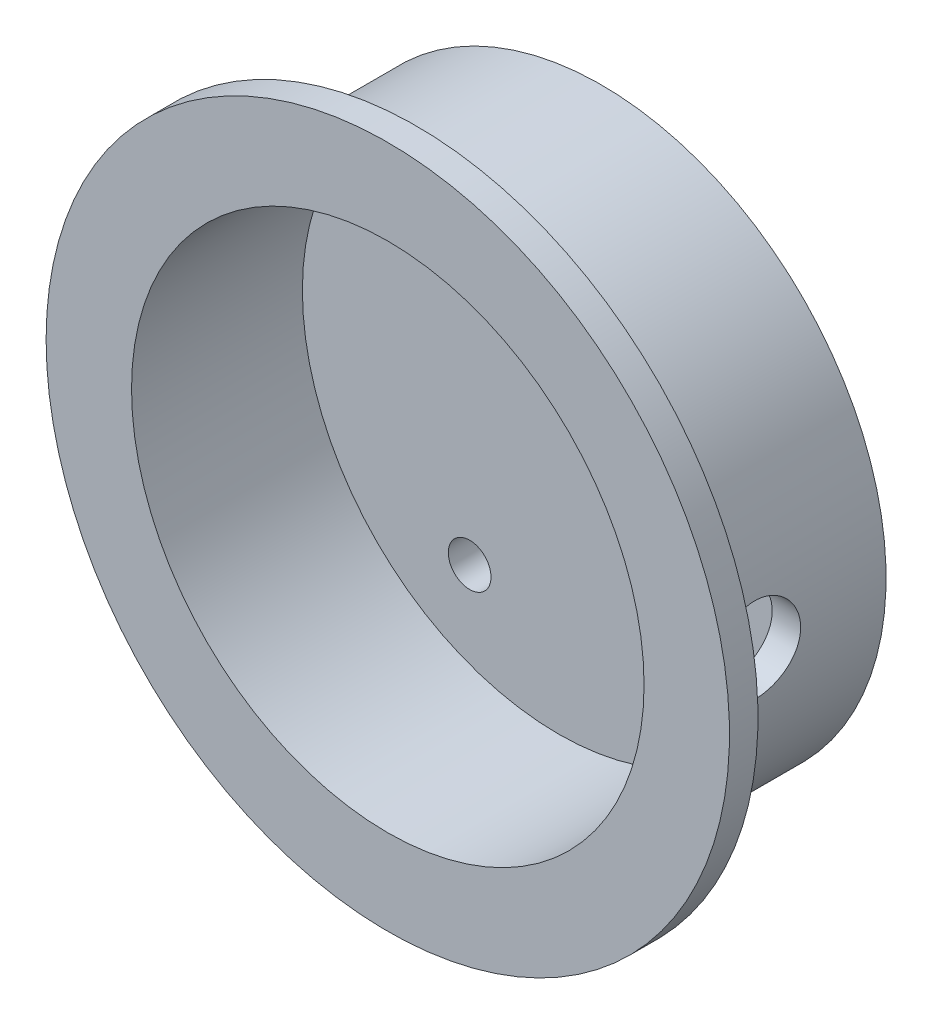
ISO-10303-21;
HEADER;
FILE_DESCRIPTION(('STEP AP214'),'2;1');
FILE_NAME('part.step','',(''),(''),'','','');
FILE_SCHEMA(('AUTOMOTIVE_DESIGN { 1 0 10303 214 1 1 1 1 }'));
ENDSEC;
DATA;
#1=APPLICATION_CONTEXT('core data for automotive mechanical design processes');
#2=APPLICATION_PROTOCOL_DEFINITION('international standard','automotive_design',2000,#1);
#3=PRODUCT_CONTEXT('',#1,'mechanical');
#4=PRODUCT('Part','Part','',(#3));
#5=PRODUCT_RELATED_PRODUCT_CATEGORY('part','',(#4));
#6=PRODUCT_DEFINITION_FORMATION('','',#4);
#7=PRODUCT_DEFINITION_CONTEXT('part definition',#1,'design');
#8=PRODUCT_DEFINITION('design','',#6,#7);
#9=PRODUCT_DEFINITION_SHAPE('','',#8);
#10=(LENGTH_UNIT() NAMED_UNIT(*) SI_UNIT(.MILLI.,.METRE.));
#11=(NAMED_UNIT(*) PLANE_ANGLE_UNIT() SI_UNIT($,.RADIAN.));
#12=(NAMED_UNIT(*) SI_UNIT($,.STERADIAN.) SOLID_ANGLE_UNIT());
#13=UNCERTAINTY_MEASURE_WITH_UNIT(LENGTH_MEASURE(1.E-05),#10,'distance_accuracy_value','');
#14=(GEOMETRIC_REPRESENTATION_CONTEXT(3) GLOBAL_UNCERTAINTY_ASSIGNED_CONTEXT((#13)) GLOBAL_UNIT_ASSIGNED_CONTEXT((#10,
#11,#12)) REPRESENTATION_CONTEXT('',''));
#15=CARTESIAN_POINT('',(0.,0.,0.));
#16=DIRECTION('',(0.,0.,1.));
#17=DIRECTION('',(1.,0.,0.));
#18=AXIS2_PLACEMENT_3D('',#15,#16,#17);
#19=CARTESIAN_POINT('',(0.,0.,0.));
#20=DIRECTION('',(0.,0.,1.));
#21=DIRECTION('',(1.,0.,0.));
#22=AXIS2_PLACEMENT_3D('',#19,#20,#21);
#23=PLANE('',#22);
#24=CARTESIAN_POINT('',(25.,0.,0.));
#25=DIRECTION('',(0.,0.,1.));
#26=DIRECTION('',(1.,0.,0.));
#27=AXIS2_PLACEMENT_3D('',#24,#25,#26);
#28=CIRCLE('',#27,3.);
#29=CARTESIAN_POINT('',(28.,0.,0.));
#30=VERTEX_POINT('',#29);
#31=EDGE_CURVE('E80',#30,#30,#28,.T.);
#32=ORIENTED_EDGE('',*,*,#31,.T.);
#33=EDGE_LOOP('',(#32));
#34=FACE_BOUND('',#33,.T.);
#35=CARTESIAN_POINT('',(-12.5,21.650635,0.));
#36=DIRECTION('',(0.,0.,1.));
#37=DIRECTION('',(1.,0.,0.));
#38=AXIS2_PLACEMENT_3D('',#35,#36,#37);
#39=CIRCLE('',#38,3.);
#40=CARTESIAN_POINT('',(-9.5,21.650635,0.));
#41=VERTEX_POINT('',#40);
#42=EDGE_CURVE('E148',#41,#41,#39,.T.);
#43=ORIENTED_EDGE('',*,*,#42,.T.);
#44=EDGE_LOOP('',(#43));
#45=FACE_BOUND('',#44,.T.);
#46=CARTESIAN_POINT('',(-12.5,-21.650635,0.));
#47=DIRECTION('',(0.,0.,1.));
#48=DIRECTION('',(1.,0.,0.));
#49=AXIS2_PLACEMENT_3D('',#46,#47,#48);
#50=CIRCLE('',#49,3.);
#51=CARTESIAN_POINT('',(-9.5,-21.650635,0.));
#52=VERTEX_POINT('',#51);
#53=EDGE_CURVE('E101',#52,#52,#50,.T.);
#54=ORIENTED_EDGE('',*,*,#53,.T.);
#55=EDGE_LOOP('',(#54));
#56=FACE_BOUND('',#55,.T.);
#57=CARTESIAN_POINT('',(0.,0.,0.));
#58=DIRECTION('',(0.,0.,-1.));
#59=DIRECTION('',(-1.,0.,0.));
#60=AXIS2_PLACEMENT_3D('',#57,#58,#59);
#61=CIRCLE('',#60,40.);
#62=CARTESIAN_POINT('',(-40.,0.,0.));
#63=VERTEX_POINT('',#62);
#64=EDGE_CURVE('E10',#63,#63,#61,.T.);
#65=ORIENTED_EDGE('',*,*,#64,.T.);
#66=EDGE_LOOP('',(#65));
#67=FACE_BOUND('',#66,.T.);
#68=ADVANCED_FACE('F49',(#34,#45,#56,#67),#23,.F.);
#69=CARTESIAN_POINT('',(0.,0.,0.));
#70=DIRECTION('',(0.,0.,-1.));
#71=DIRECTION('',(-1.,0.,0.));
#72=AXIS2_PLACEMENT_3D('',#69,#70,#71);
#73=CYLINDRICAL_SURFACE('',#72,40.);
#74=CARTESIAN_POINT('',(40.,0.,12.));
#75=CARTESIAN_POINT('',(40.000000904638,-0.167561105518913,11.9999977152975));
#76=CARTESIAN_POINT('',(39.9989451176864,-0.335090191065302,12.0070215038962));
#77=CARTESIAN_POINT('',(39.9947534088658,-0.668999463498546,12.0350604514898));
#78=CARTESIAN_POINT('',(39.9916170491914,-0.835379401128417,12.0560785552486));
#79=CARTESIAN_POINT('',(39.9833481266628,-1.16585651084397,12.1119708513691));
#80=CARTESIAN_POINT('',(39.9782142059875,-1.32995205138041,12.1468544690176));
#81=CARTESIAN_POINT('',(39.9660925834295,-1.65464372746493,12.2302290278119));
#82=CARTESIAN_POINT('',(39.9591042019049,-1.81523855663821,12.2787249581143));
#83=CARTESIAN_POINT('',(39.9434791838253,-2.13155359781161,12.3888952510529));
#84=CARTESIAN_POINT('',(39.9348444241858,-2.28727912787763,12.4505546165052));
#85=CARTESIAN_POINT('',(39.916158647382,-2.59301886203376,12.586658715246));
#86=CARTESIAN_POINT('',(39.9061071086739,-2.7430309369425,12.6611081590292));
#87=CARTESIAN_POINT('',(39.8848748981357,-3.03617232953861,12.8221998890339));
#88=CARTESIAN_POINT('',(39.8736948141771,-3.17930517391521,12.9088358363352));
#89=CARTESIAN_POINT('',(39.8505062684972,-3.45784494761421,13.0937525852414));
#90=CARTESIAN_POINT('',(39.8384975000402,-3.59324898188084,13.1920377085293));
#91=CARTESIAN_POINT('',(39.8139061121188,-3.85622077185467,13.4002313424211));
#92=CARTESIAN_POINT('',(39.8013202201906,-3.98373072094197,13.5102124887627));
#93=CARTESIAN_POINT('',(39.7759972467748,-4.22909734059826,13.7405329580976));
#94=CARTESIAN_POINT('',(39.7632601110613,-4.3469504213998,13.8608760991906));
#95=CARTESIAN_POINT('',(39.7380010552656,-4.57210070831189,14.1110153472033));
#96=CARTESIAN_POINT('',(39.7254790697345,-4.67940117319674,14.2408085141573));
#97=CARTESIAN_POINT('',(39.7009948267804,-4.88277663169576,14.5090359266964));
#98=CARTESIAN_POINT('',(39.6890327775157,-4.97884747021878,14.6474733418682));
#99=CARTESIAN_POINT('',(39.6659601731825,-5.15945090824631,14.932642970488));
#100=CARTESIAN_POINT('',(39.6548537615265,-5.24392874239037,15.0794102164307));
#101=CARTESIAN_POINT('',(39.6338696788524,-5.40024032800484,15.3796814818054));
#102=CARTESIAN_POINT('',(39.623992466415,-5.47206936467646,15.5331879867512));
#103=CARTESIAN_POINT('',(39.6057632358151,-5.6024875795219,15.8457527723132));
#104=CARTESIAN_POINT('',(39.5974105895113,-5.66108221281806,16.0048087341588));
#105=CARTESIAN_POINT('',(39.5824652471853,-5.76464588036792,16.3273938916457));
#106=CARTESIAN_POINT('',(39.5758731955011,-5.80960992694476,16.4909247009076));
#107=CARTESIAN_POINT('',(39.5591431868777,-5.92286347468619,16.9838814910322));
#108=CARTESIAN_POINT('',(39.5518880953599,-5.97064287422985,17.318386497531));
#109=CARTESIAN_POINT('',(39.5460104933124,-6.00944223175643,17.9905557371175));
#110=CARTESIAN_POINT('',(39.5473874871253,-6.00046544869915,18.3282197877));
#111=CARTESIAN_POINT('',(39.5585496514257,-5.92642475851388,18.9943908015818));
#112=CARTESIAN_POINT('',(39.5682649962954,-5.86182661199707,19.3229504829541));
#113=CARTESIAN_POINT('',(39.5949040792143,-5.67908592129697,19.9645010985737));
#114=CARTESIAN_POINT('',(39.6118280211808,-5.56094186239592,20.2774915921187));
#115=CARTESIAN_POINT('',(39.651053488073,-5.27398381101333,20.8804525087129));
#116=CARTESIAN_POINT('',(39.6733758884201,-5.10497248282539,21.1703276146447));
#117=CARTESIAN_POINT('',(39.7208682852217,-4.72121661366651,21.7177786448698));
#118=CARTESIAN_POINT('',(39.7460384685193,-4.50646907112456,21.9753524475332));
#119=CARTESIAN_POINT('',(39.7966989270769,-4.03477969906616,22.4535905717985));
#120=CARTESIAN_POINT('',(39.8221898858062,-3.77743731211938,22.6738599420845));
#121=CARTESIAN_POINT('',(39.8703859046449,-3.2292283660254,23.06814375709));
#122=CARTESIAN_POINT('',(39.8930909525546,-2.93836166008339,23.2421579992585));
#123=CARTESIAN_POINT('',(39.9331806237617,-2.331018391123,23.5390123409123));
#124=CARTESIAN_POINT('',(39.9505620771063,-2.01452671087442,23.6618219660951));
#125=CARTESIAN_POINT('',(39.9780196221935,-1.36509273042091,23.8524375600075));
#126=CARTESIAN_POINT('',(39.9880962078078,-1.0321515439695,23.9202472472411));
#127=CARTESIAN_POINT('',(39.9997432453657,-0.362678270417002,23.9984129192878));
#128=CARTESIAN_POINT('',(40.0013940835711,-0.0262109273182469,24.009311886843));
#129=CARTESIAN_POINT('',(39.9962224406535,0.64374671048551,23.9747879774302));
#130=CARTESIAN_POINT('',(39.9894002218434,0.977237097030591,23.929366844046));
#131=CARTESIAN_POINT('',(39.9680987444256,1.63012955022016,23.7839436045459));
#132=CARTESIAN_POINT('',(39.9536566076142,1.94959185413062,23.6842060355374));
#133=CARTESIAN_POINT('',(39.91872942704,2.56725983276065,23.4332599904913));
#134=CARTESIAN_POINT('',(39.8982440994957,2.8654645084294,23.2820490972735));
#135=CARTESIAN_POINT('',(39.8533072960952,3.43453992396779,22.9311751756704));
#136=CARTESIAN_POINT('',(39.8288280551376,3.70519606502782,22.7311677167789));
#137=CARTESIAN_POINT('',(39.7787145304194,4.20929466724779,22.288856476639));
#138=CARTESIAN_POINT('',(39.7530801795945,4.44273496411942,22.0465502372194));
#139=CARTESIAN_POINT('',(39.7032905347918,4.86775149413185,21.5241069093635));
#140=CARTESIAN_POINT('',(39.6791493006289,5.05896374897781,21.2436722033505));
#141=CARTESIAN_POINT('',(39.6353289042669,5.3915648117521,20.6543319339288));
#142=CARTESIAN_POINT('',(39.6156496215148,5.53295496583064,20.3454271400419));
#143=CARTESIAN_POINT('',(39.5830807993143,5.7613400286209,19.7090643875868));
#144=CARTESIAN_POINT('',(39.570167378912,5.84852646230101,19.3816762648898));
#145=CARTESIAN_POINT('',(39.5525372331235,5.96661700377158,18.7165098332219));
#146=CARTESIAN_POINT('',(39.5478199416889,5.9975249983212,18.3787322434175));
#147=CARTESIAN_POINT('',(39.5472834921233,6.00101575215408,17.8738165183001));
#148=CARTESIAN_POINT('',(39.5481759057259,5.99515666053904,17.706560625329));
#149=CARTESIAN_POINT('',(39.5520574049984,5.96950339135657,17.3731623070127));
#150=CARTESIAN_POINT('',(39.5550457059416,5.94971442929869,17.2070194884152));
#151=CARTESIAN_POINT('',(39.5630376239274,5.89633514048051,16.8769665226951));
#152=CARTESIAN_POINT('',(39.5680419665934,5.86273984439065,16.713057201447));
#153=CARTESIAN_POINT('',(39.579918267669,5.78201823632873,16.3887348610991));
#154=CARTESIAN_POINT('',(39.5867895508178,5.73489681632584,16.2283206004739));
#155=CARTESIAN_POINT('',(39.6022008561964,5.62748842275754,15.9121196212927));
#156=CARTESIAN_POINT('',(39.6107401970208,5.56720682397764,15.7563310429708));
#157=CARTESIAN_POINT('',(39.629243299894,5.43393018153574,15.4504461800627));
#158=CARTESIAN_POINT('',(39.6392065485716,5.36093971782559,15.3003478684972));
#159=CARTESIAN_POINT('',(39.6602830942565,5.20272169948106,15.0067567816112));
#160=CARTESIAN_POINT('',(39.6713968292032,5.11748948013186,14.8632665519482));
#161=CARTESIAN_POINT('',(39.6944560246636,4.93544048003527,14.5839783618971));
#162=CARTESIAN_POINT('',(39.7064011892234,4.83862781271003,14.4481776952496));
#163=CARTESIAN_POINT('',(39.730916991987,4.63303947233526,14.1838156811903));
#164=CARTESIAN_POINT('',(39.7434926877539,4.5241539193949,14.0553402386394));
#165=CARTESIAN_POINT('',(39.7687986996949,4.29602285455152,13.8080461119541));
#166=CARTESIAN_POINT('',(39.7815289586562,4.17678108121247,13.6892239727401));
#167=CARTESIAN_POINT('',(39.806799006895,3.92865238364559,13.4619372132391));
#168=CARTESIAN_POINT('',(39.8193386774513,3.79975972188475,13.3534788429127));
#169=CARTESIAN_POINT('',(39.8438635725316,3.53333016468473,13.1477953099453));
#170=CARTESIAN_POINT('',(39.8558490001169,3.39579647937474,13.0505660133727));
#171=CARTESIAN_POINT('',(39.8790025922409,3.11215574730478,12.8674421801433));
#172=CARTESIAN_POINT('',(39.8901655250025,2.96600295810818,12.7816178082335));
#173=CARTESIAN_POINT('',(39.9112746238806,2.66694921361599,12.6226354113886));
#174=CARTESIAN_POINT('',(39.9212212367855,2.51405076444429,12.5494727313343));
#175=CARTESIAN_POINT('',(39.9396125576065,2.20264573310492,12.4163633142467));
#176=CARTESIAN_POINT('',(39.9480583637205,2.04414335422427,12.3564069059193));
#177=CARTESIAN_POINT('',(39.9632145909449,1.72261317596796,12.250106128343));
#178=CARTESIAN_POINT('',(39.9699254005144,1.55958639865492,12.203758711778));
#179=CARTESIAN_POINT('',(39.9836298107859,1.16676093203627,12.1098711695573));
#180=CARTESIAN_POINT('',(39.9897412844584,0.9353751410567,12.0687155091073));
#181=CARTESIAN_POINT('',(39.9979257206312,0.469305279953768,12.0137816939604));
#182=CARTESIAN_POINT('',(39.9999987333141,0.234621250851353,12.0000031990703));
#183=CARTESIAN_POINT('',(40.,0.,12.));
#184=B_SPLINE_CURVE_WITH_KNOTS('',3,(#74,#75,#76,#77,#78,#79,#80,#81,#82,#83,#84,#85,#86,#87,
#88,#89,#90,#91,#92,#93,#94,#95,#96,#97,#98,#99,#100,#101,#102,#103,#104,#105,#106,#107,#108,
#109,#110,#111,#112,#113,#114,#115,#116,#117,#118,#119,#120,#121,#122,#123,#124,#125,#126,#127,
#128,#129,#130,#131,#132,#133,#134,#135,#136,#137,#138,#139,#140,#141,#142,#143,#144,#145,#146,
#147,#148,#149,#150,#151,#152,#153,#154,#155,#156,#157,#158,#159,#160,#161,#162,#163,#164,#165,
#166,#167,#168,#169,#170,#171,#172,#173,#174,#175,#176,#177,#178,#179,#180,#181,#182,#183),
.UNSPECIFIED.,.T.,.F.,(4,2,2,2,2,2,2,2,2,2,2,2,2,2,2,2,2,2,2,2,2,2,2,2,2,2,2,2,2,2,2,2,2,2,2,2,
2,2,2,2,2,2,2,2,2,2,2,2,2,2,2,2,2,2,4),(0.,0.502477814422918,1.00506139653679,1.50798720309687,
2.01109758221808,2.51363779468108,3.01636348746509,3.51882864333028,4.02148079373285,
4.52746031632925,5.03362708240556,5.5396370440347,6.04583364644517,6.55434475686612,
7.0630450137982,7.57153520405512,8.08021123604621,9.08884357126294,10.0974179909853,
11.0976280748558,12.0978664546404,13.1020363260723,14.1062721193673,15.1205526372423,
16.1348375965727,17.149725346421,18.164544474762,19.1696633287962,20.1747510666722,
21.1749869456639,22.1752698020769,23.1828285085023,24.1904457881712,25.2064356504128,
26.2223980593793,27.2347499253127,28.247031872513,28.748625842553,29.2500321096538,
29.7516190067674,30.2530247239143,30.7542260423741,31.2552471130489,31.7564596065596,
32.2574945930955,32.7635364868209,33.2693964543006,33.775559584778,34.2815357756023,
34.7904933793059,35.2992634634407,35.8076597141104,36.3159420380732,37.0195267867678,
37.7231027925471),.UNSPECIFIED.);
#185=CARTESIAN_POINT('',(40.,0.,12.));
#186=VERTEX_POINT('',#185);
#187=EDGE_CURVE('E152',#186,#186,#184,.T.);
#188=ORIENTED_EDGE('',*,*,#187,.T.);
#189=EDGE_LOOP('',(#188));
#190=FACE_BOUND('',#189,.T.);
#191=ORIENTED_EDGE('',*,*,#64,.F.);
#192=EDGE_LOOP('',(#191));
#193=FACE_BOUND('',#192,.T.);
#194=CARTESIAN_POINT('',(0.,0.,26.));
#195=DIRECTION('',(0.,0.,-1.));
#196=DIRECTION('',(-1.,0.,0.));
#197=AXIS2_PLACEMENT_3D('',#194,#195,#196);
#198=CIRCLE('',#197,40.);
#199=CARTESIAN_POINT('',(-40.,0.,26.));
#200=VERTEX_POINT('',#199);
#201=EDGE_CURVE('E63',#200,#200,#198,.T.);
#202=ORIENTED_EDGE('',*,*,#201,.T.);
#203=EDGE_LOOP('',(#202));
#204=FACE_BOUND('',#203,.T.);
#205=ADVANCED_FACE('F137',(#190,#193,#204),#73,.T.);
#206=CARTESIAN_POINT('',(40.,0.,26.));
#207=DIRECTION('',(0.,0.,1.));
#208=DIRECTION('',(1.,0.,0.));
#209=AXIS2_PLACEMENT_3D('',#206,#207,#208);
#210=PLANE('',#209);
#211=ORIENTED_EDGE('',*,*,#201,.F.);
#212=EDGE_LOOP('',(#211));
#213=FACE_BOUND('',#212,.T.);
#214=CARTESIAN_POINT('',(0.,0.,26.));
#215=DIRECTION('',(0.,0.,-1.));
#216=DIRECTION('',(-1.,0.,0.));
#217=AXIS2_PLACEMENT_3D('',#214,#215,#216);
#218=CIRCLE('',#217,48.);
#219=CARTESIAN_POINT('',(-48.,0.,26.));
#220=VERTEX_POINT('',#219);
#221=EDGE_CURVE('E71',#220,#220,#218,.T.);
#222=ORIENTED_EDGE('',*,*,#221,.T.);
#223=EDGE_LOOP('',(#222));
#224=FACE_BOUND('',#223,.T.);
#225=ADVANCED_FACE('F110',(#213,#224),#210,.F.);
#226=CARTESIAN_POINT('',(0.,0.,0.));
#227=DIRECTION('',(0.,0.,-1.));
#228=DIRECTION('',(-1.,0.,0.));
#229=AXIS2_PLACEMENT_3D('',#226,#227,#228);
#230=CYLINDRICAL_SURFACE('',#229,48.);
#231=ORIENTED_EDGE('',*,*,#221,.F.);
#232=EDGE_LOOP('',(#231));
#233=FACE_BOUND('',#232,.T.);
#234=CARTESIAN_POINT('',(0.,0.,30.));
#235=DIRECTION('',(0.,0.,-1.));
#236=DIRECTION('',(-1.,0.,0.));
#237=AXIS2_PLACEMENT_3D('',#234,#235,#236);
#238=CIRCLE('',#237,48.);
#239=CARTESIAN_POINT('',(-48.,0.,30.));
#240=VERTEX_POINT('',#239);
#241=EDGE_CURVE('E98',#240,#240,#238,.T.);
#242=ORIENTED_EDGE('',*,*,#241,.T.);
#243=EDGE_LOOP('',(#242));
#244=FACE_BOUND('',#243,.T.);
#245=ADVANCED_FACE('F112',(#233,#244),#230,.T.);
#246=CARTESIAN_POINT('',(48.,0.,30.));
#247=DIRECTION('',(0.,0.,-1.));
#248=DIRECTION('',(-1.,0.,0.));
#249=AXIS2_PLACEMENT_3D('',#246,#247,#248);
#250=PLANE('',#249);
#251=ORIENTED_EDGE('',*,*,#241,.F.);
#252=EDGE_LOOP('',(#251));
#253=FACE_BOUND('',#252,.T.);
#254=CARTESIAN_POINT('',(0.,0.,30.));
#255=DIRECTION('',(0.,0.,-1.));
#256=DIRECTION('',(-1.,0.,0.));
#257=AXIS2_PLACEMENT_3D('',#254,#255,#256);
#258=CIRCLE('',#257,36.);
#259=CARTESIAN_POINT('',(-36.,0.,30.));
#260=VERTEX_POINT('',#259);
#261=EDGE_CURVE('E91',#260,#260,#258,.T.);
#262=ORIENTED_EDGE('',*,*,#261,.T.);
#263=EDGE_LOOP('',(#262));
#264=FACE_BOUND('',#263,.T.);
#265=ADVANCED_FACE('F115',(#253,#264),#250,.F.);
#266=CARTESIAN_POINT('',(0.,0.,0.));
#267=DIRECTION('',(0.,0.,-1.));
#268=DIRECTION('',(-1.,0.,0.));
#269=AXIS2_PLACEMENT_3D('',#266,#267,#268);
#270=CYLINDRICAL_SURFACE('',#269,36.);
#271=CARTESIAN_POINT('',(36.,0.,12.));
#272=CARTESIAN_POINT('',(36.000001120931,0.167326476367822,11.9999974216764));
#273=CARTESIAN_POINT('',(35.9988312480532,0.334618049994433,12.0070017067782));
#274=CARTESIAN_POINT('',(35.9941868538286,0.668050675369169,12.0349610202031));
#275=CARTESIAN_POINT('',(35.9907118762359,0.834191492770599,12.0559188103251));
#276=CARTESIAN_POINT('',(35.9815502039111,1.16418062441299,12.1116465754777));
#277=CARTESIAN_POINT('',(35.9758621140299,1.32802742486901,12.1464252635178));
#278=CARTESIAN_POINT('',(35.962431635656,1.65222296515725,12.229543266487));
#279=CARTESIAN_POINT('',(35.9546884934416,1.81257039814429,12.2778875571797));
#280=CARTESIAN_POINT('',(35.9373754638442,2.12838633702842,12.3877020016331));
#281=CARTESIAN_POINT('',(35.9278077755151,2.28386045653122,12.4491563648133));
#282=CARTESIAN_POINT('',(35.9071012464788,2.58911048609539,12.5847981220488));
#283=CARTESIAN_POINT('',(35.895961827033,2.73888427128471,12.6589902085456));
#284=CARTESIAN_POINT('',(35.8724281752068,3.03157467860604,12.8195173348591));
#285=CARTESIAN_POINT('',(35.8600345681031,3.17449466583507,12.9058463320783));
#286=CARTESIAN_POINT('',(35.8343241642847,3.45264091132371,13.0901007869074));
#287=CARTESIAN_POINT('',(35.821007025094,3.58786428121413,13.1880305560998));
#288=CARTESIAN_POINT('',(35.7937081273873,3.85072260384334,13.3956311419925));
#289=CARTESIAN_POINT('',(35.779721818227,3.97828632239252,13.5053915644248));
#290=CARTESIAN_POINT('',(35.7515724599963,4.22378286097597,13.7352670724738));
#291=CARTESIAN_POINT('',(35.7374093474098,4.34171209793812,13.8553859765886));
#292=CARTESIAN_POINT('',(35.7093126638112,4.56704280562067,14.1050813211253));
#293=CARTESIAN_POINT('',(35.6953790243549,4.67444746458755,14.2346548765364));
#294=CARTESIAN_POINT('',(35.668124054067,4.87806154520212,14.502455091108));
#295=CARTESIAN_POINT('',(35.6548029509616,4.97426682322831,14.6406849240683));
#296=CARTESIAN_POINT('',(35.6290819644227,5.15528162207231,14.925634230368));
#297=CARTESIAN_POINT('',(35.616687876023,5.2400217665173,15.0723983181338));
#298=CARTESIAN_POINT('',(35.5932612602439,5.39685484338872,15.3727069039802));
#299=CARTESIAN_POINT('',(35.5822292419465,5.46894305129416,15.526253908279));
#300=CARTESIAN_POINT('',(35.561859748107,5.5998690767528,15.8389431732165));
#301=CARTESIAN_POINT('',(35.5525215571067,5.65871249133582,15.9980830374117));
#302=CARTESIAN_POINT('',(35.5358040814927,5.76275667312805,16.3208787716798));
#303=CARTESIAN_POINT('',(35.5284255121956,5.80795245939499,16.4845362668154));
#304=CARTESIAN_POINT('',(35.509707357567,5.92172961310465,16.9773617710283));
#305=CARTESIAN_POINT('',(35.5015663192803,5.96986028830117,17.3116426384346));
#306=CARTESIAN_POINT('',(35.4948906569043,6.00941752108758,17.9834437900485));
#307=CARTESIAN_POINT('',(35.4963553529651,6.00084809165081,18.3209638433131));
#308=CARTESIAN_POINT('',(35.5086353160738,5.92774364921268,18.986213374288));
#309=CARTESIAN_POINT('',(35.5193540339082,5.86378648725039,19.3140079124876));
#310=CARTESIAN_POINT('',(35.5487876108006,5.6826087662955,19.9541347789349));
#311=CARTESIAN_POINT('',(35.567502744104,5.56538638050787,20.2664665764618));
#312=CARTESIAN_POINT('',(35.6109235780268,5.28042505889862,20.8685482004628));
#313=CARTESIAN_POINT('',(35.6356576304152,5.11244610438553,21.1581823130147));
#314=CARTESIAN_POINT('',(35.6883100221192,4.7309089310708,21.7053708228935));
#315=CARTESIAN_POINT('',(35.7162286183562,4.51734703353616,21.9629226283865));
#316=CARTESIAN_POINT('',(35.7725286745278,4.04755728491887,22.4419825345694));
#317=CARTESIAN_POINT('',(35.8009115830098,3.79083350679349,22.6630044253795));
#318=CARTESIAN_POINT('',(35.8546224320712,3.243684604058,23.0589066495136));
#319=CARTESIAN_POINT('',(35.8799503529662,2.95325926232053,23.233786685538));
#320=CARTESIAN_POINT('',(35.9247334298179,2.34649419705352,23.5324853400245));
#321=CARTESIAN_POINT('',(35.9441836418789,2.03013294087888,23.656261005125));
#322=CARTESIAN_POINT('',(35.9749800722037,1.38071602992282,23.8487861178602));
#323=CARTESIAN_POINT('',(35.9863269683988,1.0476617741894,23.9175401687145));
#324=CARTESIAN_POINT('',(35.9995471162368,0.378503762967076,23.9974112603289));
#325=CARTESIAN_POINT('',(36.0015300722583,0.0424817690039728,24.0091957736618));
#326=CARTESIAN_POINT('',(35.9960993861566,-0.626735454777282,23.9765727720442));
#327=CARTESIAN_POINT('',(35.9886861055854,-0.959930792863923,23.9321674191882));
#328=CARTESIAN_POINT('',(35.9653638463115,-1.61197482178632,23.7889803668537));
#329=CARTESIAN_POINT('',(35.9495065144606,-1.93089808585899,23.690529119523));
#330=CARTESIAN_POINT('',(35.9110671476995,-2.54771252193089,23.4423971366607));
#331=CARTESIAN_POINT('',(35.8884847351666,-2.84560251172058,23.2927135242908));
#332=CARTESIAN_POINT('',(35.8388283883542,-3.41479366124535,22.9448373747607));
#333=CARTESIAN_POINT('',(35.8117165304073,-3.68583662667881,22.7462279026294));
#334=CARTESIAN_POINT('',(35.7561232282876,-4.19098458077503,22.3067101656248));
#335=CARTESIAN_POINT('',(35.7276416847426,-4.42508688406335,22.0657988283354));
#336=CARTESIAN_POINT('',(35.6721641646139,-4.85218276333249,21.5455269311591));
#337=CARTESIAN_POINT('',(35.6451866333633,-5.04472537225506,21.2657939273405));
#338=CARTESIAN_POINT('',(35.5961168685916,-5.38008519913678,20.6775489496169));
#339=CARTESIAN_POINT('',(35.5740244802204,-5.52290399333216,20.3690378883645));
#340=CARTESIAN_POINT('',(35.5373623165037,-5.75409328027547,19.733319231273));
#341=CARTESIAN_POINT('',(35.5227615719134,-5.84268822366528,19.4061949185996));
#342=CARTESIAN_POINT('',(35.5026673333419,-5.96360030391926,18.7412573479801));
#343=CARTESIAN_POINT('',(35.4971730475981,-5.99592233345397,18.403445021908));
#344=CARTESIAN_POINT('',(35.4962262556356,-6.00147854934166,17.8987082598958));
#345=CARTESIAN_POINT('',(35.4971006813125,-5.99632770946828,17.7317556935677));
#346=CARTESIAN_POINT('',(35.5011792340142,-5.97214124162046,17.3989048986152));
#347=CARTESIAN_POINT('',(35.5043824856849,-5.95311083066153,17.2330062974565));
#348=CARTESIAN_POINT('',(35.5130311982067,-5.90129568635919,16.9033826528682));
#349=CARTESIAN_POINT('',(35.5184774597995,-5.86850604096988,16.7396584072393));
#350=CARTESIAN_POINT('',(35.5314507804463,-5.78943962105982,16.4156442541507));
#351=CARTESIAN_POINT('',(35.5389770904247,-5.74316770150639,16.2553531326891));
#352=CARTESIAN_POINT('',(35.5558885569416,-5.63752114368029,15.9393976738538));
#353=CARTESIAN_POINT('',(35.5652721916581,-5.57815722797805,15.7837296677744));
#354=CARTESIAN_POINT('',(35.585631635686,-5.44676384009959,15.4780095282742));
#355=CARTESIAN_POINT('',(35.5966068744167,-5.3747389048686,15.3279554064586));
#356=CARTESIAN_POINT('',(35.6198478052657,-5.21849398227618,15.0343662590406));
#357=CARTESIAN_POINT('',(35.6321140027357,-5.1342692143441,14.8908338180936));
#358=CARTESIAN_POINT('',(35.6575865507598,-4.9542685884504,14.611366169242));
#359=CARTESIAN_POINT('',(35.6707925701866,-4.85849679067838,14.4754283153747));
#360=CARTESIAN_POINT('',(35.6979488890627,-4.65479622441596,14.2103895615574));
#361=CARTESIAN_POINT('',(35.7119063191799,-4.5467330221464,14.081392691875));
#362=CARTESIAN_POINT('',(35.7400167165864,-4.32021089878793,13.8329839242251));
#363=CARTESIAN_POINT('',(35.7541696122689,-4.20175570382299,13.7135686198845));
#364=CARTESIAN_POINT('',(35.7822883139755,-3.95515470215777,13.4850216840271));
#365=CARTESIAN_POINT('',(35.7962540033657,-3.82700315719947,13.3758962291626));
#366=CARTESIAN_POINT('',(35.8235943083138,-3.5619973041666,13.1688051406741));
#367=CARTESIAN_POINT('',(35.8369691401358,-3.42514622576305,13.0708354027985));
#368=CARTESIAN_POINT('',(35.862853963664,-3.14260589144651,12.8860259635073));
#369=CARTESIAN_POINT('',(35.8753569302112,-2.99685941555901,12.7992727212813));
#370=CARTESIAN_POINT('',(35.8990303892714,-2.6985180888249,12.6384039033769));
#371=CARTESIAN_POINT('',(35.9102013715452,-2.54592578371849,12.5642836783001));
#372=CARTESIAN_POINT('',(35.9308909074415,-2.23502185722485,12.4292391524783));
#373=CARTESIAN_POINT('',(35.9404106071188,-2.07671429538576,12.3683056922704));
#374=CARTESIAN_POINT('',(35.9575335935905,-1.75546781194662,12.2600462173256));
#375=CARTESIAN_POINT('',(35.9651372915227,-1.59252989229851,12.2127172830073));
#376=CARTESIAN_POINT('',(35.9809299777169,-1.19459056965583,12.1152260385959));
#377=CARTESIAN_POINT('',(35.988047836193,-0.957794264620216,12.0720676115619));
#378=CARTESIAN_POINT('',(35.9975820020204,-0.480641273777353,12.0144566906415));
#379=CARTESIAN_POINT('',(35.9999983903174,-0.240284649340141,12.0000037025317));
#380=CARTESIAN_POINT('',(36.,0.,12.));
#381=B_SPLINE_CURVE_WITH_KNOTS('',3,(#271,#272,#273,#274,#275,#276,#277,#278,#279,#280,#281,
#282,#283,#284,#285,#286,#287,#288,#289,#290,#291,#292,#293,#294,#295,#296,#297,#298,#299,#300,
#301,#302,#303,#304,#305,#306,#307,#308,#309,#310,#311,#312,#313,#314,#315,#316,#317,#318,#319,
#320,#321,#322,#323,#324,#325,#326,#327,#328,#329,#330,#331,#332,#333,#334,#335,#336,#337,#338,
#339,#340,#341,#342,#343,#344,#345,#346,#347,#348,#349,#350,#351,#352,#353,#354,#355,#356,#357,
#358,#359,#360,#361,#362,#363,#364,#365,#366,#367,#368,#369,#370,#371,#372,#373,#374,#375,#376,
#377,#378,#379,#380),.UNSPECIFIED.,.T.,.F.,(4,2,2,2,2,2,2,2,2,2,2,2,2,2,2,2,2,2,2,2,2,2,2,2,2,2,
2,2,2,2,2,2,2,2,2,2,2,2,2,2,2,2,2,2,2,2,2,2,2,2,2,2,2,2,4),(0.,0.501768813163583,
1.00363697030968,1.50582201979509,2.00819150839337,2.50995929443889,3.01191232457509,
3.5136163268311,4.01550738260832,4.52150968365258,5.02769931877437,5.53373513498427,
6.03995758660705,6.54911793434207,7.05846801145671,7.56760243988106,8.07692246191768,
9.0850832673869,10.0931727206217,11.0908699391702,12.0886013775296,13.0911267761018,
14.0937331132542,15.1087638947923,16.1238012161808,17.1396899509021,18.155493685428,
19.159366620714,20.1632009297811,21.1609647850744,22.158784676746,23.165421231969,
24.1721309302232,25.1892691451033,26.2063751139431,27.2192419531361,28.2320207238264,
28.7326355601177,29.233062323576,29.7336678915563,30.2340934137777,30.7341105909936,
31.2339489561292,31.7339837181842,32.2338431669959,32.7398199152919,33.2456159777204,
33.751713745166,34.2576247106342,34.7672283877616,35.2766441057619,35.7857048422491,
36.294656250722,37.0152201555367,37.7357716542475),.UNSPECIFIED.);
#382=CARTESIAN_POINT('',(36.,0.,12.));
#383=VERTEX_POINT('',#382);
#384=EDGE_CURVE('E53',#383,#383,#381,.T.);
#385=ORIENTED_EDGE('',*,*,#384,.T.);
#386=EDGE_LOOP('',(#385));
#387=FACE_BOUND('',#386,.T.);
#388=ORIENTED_EDGE('',*,*,#261,.F.);
#389=EDGE_LOOP('',(#388));
#390=FACE_BOUND('',#389,.T.);
#391=CARTESIAN_POINT('',(0.,0.,6.));
#392=DIRECTION('',(0.,0.,-1.));
#393=DIRECTION('',(-1.,0.,0.));
#394=AXIS2_PLACEMENT_3D('',#391,#392,#393);
#395=CIRCLE('',#394,36.);
#396=CARTESIAN_POINT('',(-36.,0.,6.));
#397=VERTEX_POINT('',#396);
#398=EDGE_CURVE('E85',#397,#397,#395,.T.);
#399=ORIENTED_EDGE('',*,*,#398,.T.);
#400=EDGE_LOOP('',(#399));
#401=FACE_BOUND('',#400,.T.);
#402=ADVANCED_FACE('F121',(#387,#390,#401),#270,.F.);
#403=CARTESIAN_POINT('',(36.,0.,6.));
#404=DIRECTION('',(0.,0.,-1.));
#405=DIRECTION('',(-1.,0.,0.));
#406=AXIS2_PLACEMENT_3D('',#403,#404,#405);
#407=PLANE('',#406);
#408=CARTESIAN_POINT('',(25.,0.,6.));
#409=DIRECTION('',(0.,0.,-1.));
#410=DIRECTION('',(-1.,0.,0.));
#411=AXIS2_PLACEMENT_3D('',#408,#409,#410);
#412=CIRCLE('',#411,3.);
#413=CARTESIAN_POINT('',(22.,0.,6.));
#414=VERTEX_POINT('',#413);
#415=EDGE_CURVE('E82',#414,#414,#412,.F.);
#416=ORIENTED_EDGE('',*,*,#415,.F.);
#417=EDGE_LOOP('',(#416));
#418=FACE_BOUND('',#417,.T.);
#419=CARTESIAN_POINT('',(-12.5,21.650635,6.));
#420=DIRECTION('',(0.,0.,-1.));
#421=DIRECTION('',(-1.,0.,0.));
#422=AXIS2_PLACEMENT_3D('',#419,#420,#421);
#423=CIRCLE('',#422,3.);
#424=CARTESIAN_POINT('',(-15.5,21.650635,6.));
#425=VERTEX_POINT('',#424);
#426=EDGE_CURVE('E79',#425,#425,#423,.F.);
#427=ORIENTED_EDGE('',*,*,#426,.F.);
#428=EDGE_LOOP('',(#427));
#429=FACE_BOUND('',#428,.T.);
#430=CARTESIAN_POINT('',(-12.5,-21.650635,6.));
#431=DIRECTION('',(0.,0.,-1.));
#432=DIRECTION('',(-1.,0.,0.));
#433=AXIS2_PLACEMENT_3D('',#430,#431,#432);
#434=CIRCLE('',#433,3.);
#435=CARTESIAN_POINT('',(-15.5,-21.650635,6.));
#436=VERTEX_POINT('',#435);
#437=EDGE_CURVE('E75',#436,#436,#434,.F.);
#438=ORIENTED_EDGE('',*,*,#437,.F.);
#439=EDGE_LOOP('',(#438));
#440=FACE_BOUND('',#439,.T.);
#441=ORIENTED_EDGE('',*,*,#398,.F.);
#442=EDGE_LOOP('',(#441));
#443=FACE_BOUND('',#442,.T.);
#444=ADVANCED_FACE('F126',(#418,#429,#440,#443),#407,.F.);
#445=CARTESIAN_POINT('',(-12.5,-21.650635,30.));
#446=DIRECTION('',(0.,0.,-1.));
#447=DIRECTION('',(-1.,0.,0.));
#448=AXIS2_PLACEMENT_3D('',#445,#446,#447);
#449=CYLINDRICAL_SURFACE('',#448,3.);
#450=ORIENTED_EDGE('',*,*,#53,.F.);
#451=EDGE_LOOP('',(#450));
#452=FACE_BOUND('',#451,.T.);
#453=ORIENTED_EDGE('',*,*,#437,.T.);
#454=EDGE_LOOP('',(#453));
#455=FACE_BOUND('',#454,.T.);
#456=ADVANCED_FACE('F130',(#452,#455),#449,.F.);
#457=CARTESIAN_POINT('',(-12.5,21.650635,30.));
#458=DIRECTION('',(0.,0.,-1.));
#459=DIRECTION('',(-1.,0.,0.));
#460=AXIS2_PLACEMENT_3D('',#457,#458,#459);
#461=CYLINDRICAL_SURFACE('',#460,3.);
#462=ORIENTED_EDGE('',*,*,#42,.F.);
#463=EDGE_LOOP('',(#462));
#464=FACE_BOUND('',#463,.T.);
#465=ORIENTED_EDGE('',*,*,#426,.T.);
#466=EDGE_LOOP('',(#465));
#467=FACE_BOUND('',#466,.T.);
#468=ADVANCED_FACE('F176',(#464,#467),#461,.F.);
#469=CARTESIAN_POINT('',(25.,0.,30.));
#470=DIRECTION('',(0.,0.,-1.));
#471=DIRECTION('',(-1.,0.,0.));
#472=AXIS2_PLACEMENT_3D('',#469,#470,#471);
#473=CYLINDRICAL_SURFACE('',#472,3.);
#474=ORIENTED_EDGE('',*,*,#31,.F.);
#475=EDGE_LOOP('',(#474));
#476=FACE_BOUND('',#475,.T.);
#477=ORIENTED_EDGE('',*,*,#415,.T.);
#478=EDGE_LOOP('',(#477));
#479=FACE_BOUND('',#478,.T.);
#480=ADVANCED_FACE('F170',(#476,#479),#473,.F.);
#481=CARTESIAN_POINT('',(34.,0.,18.));
#482=DIRECTION('',(1.,0.,0.));
#483=DIRECTION('',(0.,0.,-1.));
#484=AXIS2_PLACEMENT_3D('',#481,#482,#483);
#485=CYLINDRICAL_SURFACE('',#484,6.);
#486=ORIENTED_EDGE('',*,*,#384,.F.);
#487=EDGE_LOOP('',(#486));
#488=FACE_BOUND('',#487,.T.);
#489=ORIENTED_EDGE('',*,*,#187,.F.);
#490=EDGE_LOOP('',(#489));
#491=FACE_BOUND('',#490,.T.);
#492=ADVANCED_FACE('F165',(#488,#491),#485,.F.);
#493=CLOSED_SHELL('',(#68,#205,#225,#245,#265,#402,#444,#456,#468,#480,#492));
#494=MANIFOLD_SOLID_BREP('B2',#493);
#495=ADVANCED_BREP_SHAPE_REPRESENTATION('',(#18,#494),#14);
#496=SHAPE_DEFINITION_REPRESENTATION(#9,#495);
ENDSEC;
END-ISO-10303-21;
